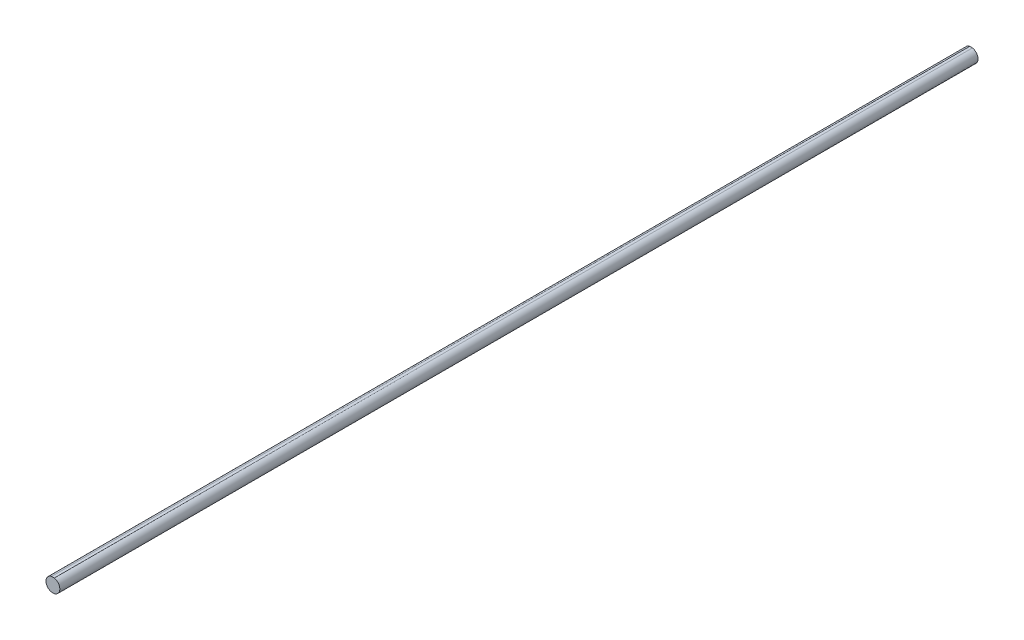
ISO-10303-21;
HEADER;
FILE_DESCRIPTION(('STEP AP214'),'2;1');
FILE_NAME('part.step','',(''),(''),'','','');
FILE_SCHEMA(('AUTOMOTIVE_DESIGN { 1 0 10303 214 1 1 1 1 }'));
ENDSEC;
DATA;
#1=APPLICATION_CONTEXT('core data for automotive mechanical design processes');
#2=APPLICATION_PROTOCOL_DEFINITION('international standard','automotive_design',2000,#1);
#3=PRODUCT_CONTEXT('',#1,'mechanical');
#4=PRODUCT('Part','Part','',(#3));
#5=PRODUCT_RELATED_PRODUCT_CATEGORY('part','',(#4));
#6=PRODUCT_DEFINITION_FORMATION('','',#4);
#7=PRODUCT_DEFINITION_CONTEXT('part definition',#1,'design');
#8=PRODUCT_DEFINITION('design','',#6,#7);
#9=PRODUCT_DEFINITION_SHAPE('','',#8);
#10=(LENGTH_UNIT() NAMED_UNIT(*) SI_UNIT(.MILLI.,.METRE.));
#11=(NAMED_UNIT(*) PLANE_ANGLE_UNIT() SI_UNIT($,.RADIAN.));
#12=(NAMED_UNIT(*) SI_UNIT($,.STERADIAN.) SOLID_ANGLE_UNIT());
#13=UNCERTAINTY_MEASURE_WITH_UNIT(LENGTH_MEASURE(1.E-05),#10,'distance_accuracy_value','');
#14=(GEOMETRIC_REPRESENTATION_CONTEXT(3) GLOBAL_UNCERTAINTY_ASSIGNED_CONTEXT((#13)) GLOBAL_UNIT_ASSIGNED_CONTEXT((#10,
#11,#12)) REPRESENTATION_CONTEXT('',''));
#15=CARTESIAN_POINT('',(0.,0.,0.));
#16=DIRECTION('',(0.,0.,1.));
#17=DIRECTION('',(1.,0.,0.));
#18=AXIS2_PLACEMENT_3D('',#15,#16,#17);
#19=CARTESIAN_POINT('',(0.,0.,-665.));
#20=DIRECTION('',(0.,0.,1.));
#21=DIRECTION('',(1.,0.,0.));
#22=AXIS2_PLACEMENT_3D('',#19,#20,#21);
#23=CYLINDRICAL_SURFACE('',#22,5.);
#24=CARTESIAN_POINT('',(0.,0.,0.));
#25=DIRECTION('',(0.,0.,1.));
#26=DIRECTION('',(1.,0.,0.));
#27=AXIS2_PLACEMENT_3D('',#24,#25,#26);
#28=CIRCLE('',#27,5.);
#29=CARTESIAN_POINT('',(-0.994987437106621,4.9,0.));
#30=VERTEX_POINT('',#29);
#31=CARTESIAN_POINT('',(0.994987437106621,4.9,0.));
#32=VERTEX_POINT('',#31);
#33=EDGE_CURVE('E38',#30,#32,#28,.T.);
#34=ORIENTED_EDGE('',*,*,#33,.F.);
#35=DIRECTION('',(0.,0.,1.));
#36=VECTOR('',#35,1.);
#37=CARTESIAN_POINT('',(-0.994987437106621,4.9,-665.));
#38=LINE('',#37,#36);
#39=CARTESIAN_POINT('',(-0.994987437106621,4.9,-665.));
#40=VERTEX_POINT('',#39);
#41=EDGE_CURVE('E49',#40,#30,#38,.T.);
#42=ORIENTED_EDGE('',*,*,#41,.F.);
#43=CARTESIAN_POINT('',(0.,0.,-665.));
#44=DIRECTION('',(0.,0.,1.));
#45=DIRECTION('',(1.,0.,0.));
#46=AXIS2_PLACEMENT_3D('',#43,#44,#45);
#47=CIRCLE('',#46,5.);
#48=CARTESIAN_POINT('',(0.994987437106621,4.9,-665.));
#49=VERTEX_POINT('',#48);
#50=EDGE_CURVE('E11',#40,#49,#47,.T.);
#51=ORIENTED_EDGE('',*,*,#50,.T.);
#52=DIRECTION('',(0.,0.,1.));
#53=VECTOR('',#52,1.);
#54=CARTESIAN_POINT('',(0.994987437106621,4.9,-665.));
#55=LINE('',#54,#53);
#56=EDGE_CURVE('E61',#49,#32,#55,.T.);
#57=ORIENTED_EDGE('',*,*,#56,.T.);
#58=EDGE_LOOP('',(#34,#42,#51,#57));
#59=FACE_BOUND('',#58,.T.);
#60=ADVANCED_FACE('F35',(#59),#23,.T.);
#61=CARTESIAN_POINT('',(0.,0.,-665.));
#62=DIRECTION('',(0.,0.,1.));
#63=DIRECTION('',(1.,0.,0.));
#64=AXIS2_PLACEMENT_3D('',#61,#62,#63);
#65=PLANE('',#64);
#66=DIRECTION('',(-1.,0.,0.));
#67=VECTOR('',#66,1.);
#68=CARTESIAN_POINT('',(0.,4.9,-665.));
#69=LINE('',#68,#67);
#70=EDGE_CURVE('E55',#49,#40,#69,.T.);
#71=ORIENTED_EDGE('',*,*,#70,.F.);
#72=ORIENTED_EDGE('',*,*,#50,.F.);
#73=EDGE_LOOP('',(#71,#72));
#74=FACE_BOUND('',#73,.T.);
#75=ADVANCED_FACE('F73',(#74),#65,.F.);
#76=CARTESIAN_POINT('',(0.,0.,0.));
#77=DIRECTION('',(0.,0.,1.));
#78=DIRECTION('',(1.,0.,0.));
#79=AXIS2_PLACEMENT_3D('',#76,#77,#78);
#80=PLANE('',#79);
#81=ORIENTED_EDGE('',*,*,#33,.T.);
#82=DIRECTION('',(-1.,0.,0.));
#83=VECTOR('',#82,1.);
#84=CARTESIAN_POINT('',(0.,4.9,0.));
#85=LINE('',#84,#83);
#86=EDGE_CURVE('E58',#32,#30,#85,.T.);
#87=ORIENTED_EDGE('',*,*,#86,.T.);
#88=EDGE_LOOP('',(#81,#87));
#89=FACE_BOUND('',#88,.T.);
#90=ADVANCED_FACE('F69',(#89),#80,.T.);
#91=CARTESIAN_POINT('',(0.,4.9,-665.));
#92=DIRECTION('',(0.,1.,0.));
#93=DIRECTION('',(0.,0.,1.));
#94=AXIS2_PLACEMENT_3D('',#91,#92,#93);
#95=PLANE('',#94);
#96=ORIENTED_EDGE('',*,*,#86,.F.);
#97=ORIENTED_EDGE('',*,*,#56,.F.);
#98=ORIENTED_EDGE('',*,*,#70,.T.);
#99=ORIENTED_EDGE('',*,*,#41,.T.);
#100=EDGE_LOOP('',(#96,#97,#98,#99));
#101=FACE_BOUND('',#100,.T.);
#102=ADVANCED_FACE('F60',(#101),#95,.T.);
#103=CLOSED_SHELL('',(#60,#75,#90,#102));
#104=MANIFOLD_SOLID_BREP('B2',#103);
#105=ADVANCED_BREP_SHAPE_REPRESENTATION('',(#18,#104),#14);
#106=SHAPE_DEFINITION_REPRESENTATION(#9,#105);
ENDSEC;
END-ISO-10303-21;
